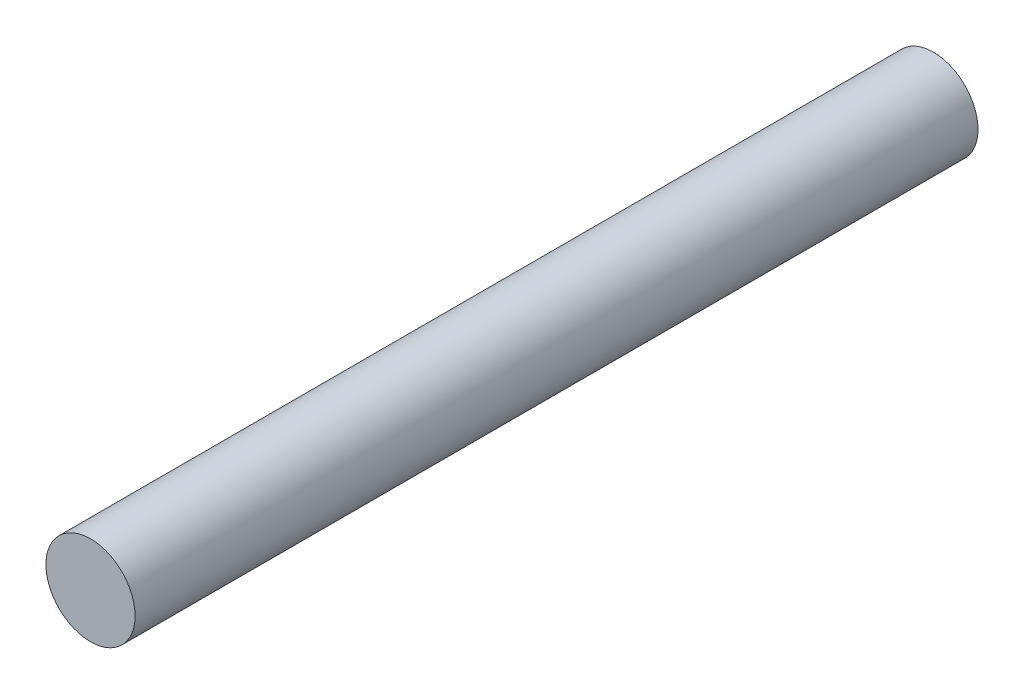
ISO-10303-21;
HEADER;
FILE_DESCRIPTION(('STEP AP214'),'2;1');
FILE_NAME('part.step','',(''),(''),'','','');
FILE_SCHEMA(('AUTOMOTIVE_DESIGN { 1 0 10303 214 1 1 1 1 }'));
ENDSEC;
DATA;
#1=APPLICATION_CONTEXT('core data for automotive mechanical design processes');
#2=APPLICATION_PROTOCOL_DEFINITION('international standard','automotive_design',2000,#1);
#3=PRODUCT_CONTEXT('',#1,'mechanical');
#4=PRODUCT('Part','Part','',(#3));
#5=PRODUCT_RELATED_PRODUCT_CATEGORY('part','',(#4));
#6=PRODUCT_DEFINITION_FORMATION('','',#4);
#7=PRODUCT_DEFINITION_CONTEXT('part definition',#1,'design');
#8=PRODUCT_DEFINITION('design','',#6,#7);
#9=PRODUCT_DEFINITION_SHAPE('','',#8);
#10=(LENGTH_UNIT() NAMED_UNIT(*) SI_UNIT(.MILLI.,.METRE.));
#11=(NAMED_UNIT(*) PLANE_ANGLE_UNIT() SI_UNIT($,.RADIAN.));
#12=(NAMED_UNIT(*) SI_UNIT($,.STERADIAN.) SOLID_ANGLE_UNIT());
#13=UNCERTAINTY_MEASURE_WITH_UNIT(LENGTH_MEASURE(1.E-05),#10,'distance_accuracy_value','');
#14=(GEOMETRIC_REPRESENTATION_CONTEXT(3) GLOBAL_UNCERTAINTY_ASSIGNED_CONTEXT((#13)) GLOBAL_UNIT_ASSIGNED_CONTEXT((#10,
#11,#12)) REPRESENTATION_CONTEXT('',''));
#15=CARTESIAN_POINT('',(0.,0.,0.));
#16=DIRECTION('',(0.,0.,1.));
#17=DIRECTION('',(1.,0.,0.));
#18=AXIS2_PLACEMENT_3D('',#15,#16,#17);
#19=CARTESIAN_POINT('',(0.,0.,-120.));
#20=DIRECTION('',(0.,0.,1.));
#21=DIRECTION('',(1.,0.,0.));
#22=AXIS2_PLACEMENT_3D('',#19,#20,#21);
#23=CYLINDRICAL_SURFACE('',#22,6.35);
#24=CARTESIAN_POINT('',(0.,0.,-120.));
#25=DIRECTION('',(0.,0.,1.));
#26=DIRECTION('',(1.,0.,0.));
#27=AXIS2_PLACEMENT_3D('',#24,#25,#26);
#28=CIRCLE('',#27,6.35);
#29=CARTESIAN_POINT('',(6.35,0.,-120.));
#30=VERTEX_POINT('',#29);
#31=EDGE_CURVE('E10',#30,#30,#28,.T.);
#32=ORIENTED_EDGE('',*,*,#31,.T.);
#33=EDGE_LOOP('',(#32));
#34=FACE_BOUND('',#33,.T.);
#35=CARTESIAN_POINT('',(0.,0.,0.));
#36=DIRECTION('',(0.,0.,1.));
#37=DIRECTION('',(1.,0.,0.));
#38=AXIS2_PLACEMENT_3D('',#35,#36,#37);
#39=CIRCLE('',#38,6.35);
#40=CARTESIAN_POINT('',(6.35,0.,0.));
#41=VERTEX_POINT('',#40);
#42=EDGE_CURVE('E34',#41,#41,#39,.T.);
#43=ORIENTED_EDGE('',*,*,#42,.F.);
#44=EDGE_LOOP('',(#43));
#45=FACE_BOUND('',#44,.T.);
#46=ADVANCED_FACE('F31',(#34,#45),#23,.T.);
#47=CARTESIAN_POINT('',(0.,0.,-120.));
#48=DIRECTION('',(0.,0.,1.));
#49=DIRECTION('',(1.,0.,0.));
#50=AXIS2_PLACEMENT_3D('',#47,#48,#49);
#51=PLANE('',#50);
#52=ORIENTED_EDGE('',*,*,#31,.F.);
#53=EDGE_LOOP('',(#52));
#54=FACE_BOUND('',#53,.T.);
#55=ADVANCED_FACE('F46',(#54),#51,.F.);
#56=CARTESIAN_POINT('',(0.,0.,0.));
#57=DIRECTION('',(0.,0.,1.));
#58=DIRECTION('',(1.,0.,0.));
#59=AXIS2_PLACEMENT_3D('',#56,#57,#58);
#60=PLANE('',#59);
#61=ORIENTED_EDGE('',*,*,#42,.T.);
#62=EDGE_LOOP('',(#61));
#63=FACE_BOUND('',#62,.T.);
#64=ADVANCED_FACE('F43',(#63),#60,.T.);
#65=CLOSED_SHELL('',(#46,#55,#64));
#66=MANIFOLD_SOLID_BREP('B2',#65);
#67=ADVANCED_BREP_SHAPE_REPRESENTATION('',(#18,#66),#14);
#68=SHAPE_DEFINITION_REPRESENTATION(#9,#67);
ENDSEC;
END-ISO-10303-21;
